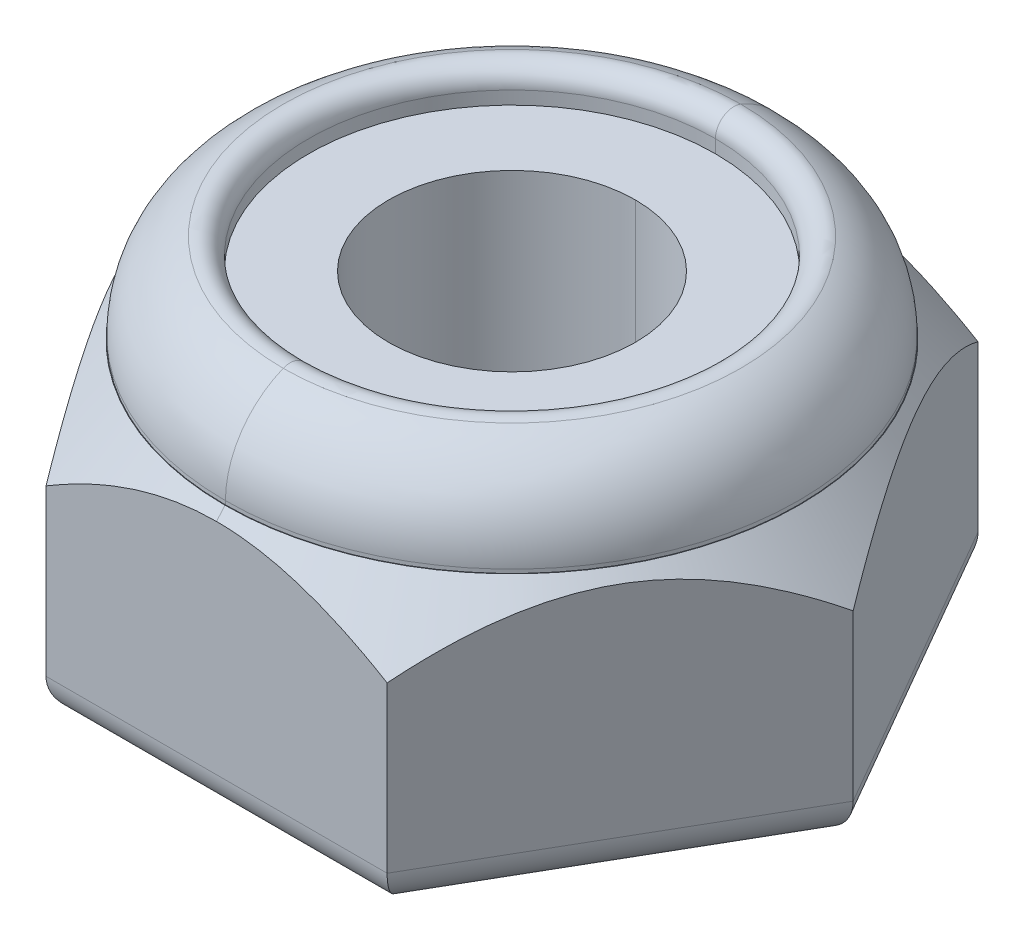
ISO-10303-21;
HEADER;
FILE_DESCRIPTION(('STEP AP214'),'2;1');
FILE_NAME('part.step','',(''),(''),'','','');
FILE_SCHEMA(('AUTOMOTIVE_DESIGN { 1 0 10303 214 1 1 1 1 }'));
ENDSEC;
DATA;
#1=APPLICATION_CONTEXT('core data for automotive mechanical design processes');
#2=APPLICATION_PROTOCOL_DEFINITION('international standard','automotive_design',2000,#1);
#3=PRODUCT_CONTEXT('',#1,'mechanical');
#4=PRODUCT('Part','Part','',(#3));
#5=PRODUCT_RELATED_PRODUCT_CATEGORY('part','',(#4));
#6=PRODUCT_DEFINITION_FORMATION('','',#4);
#7=PRODUCT_DEFINITION_CONTEXT('part definition',#1,'design');
#8=PRODUCT_DEFINITION('design','',#6,#7);
#9=PRODUCT_DEFINITION_SHAPE('','',#8);
#10=(LENGTH_UNIT() NAMED_UNIT(*) SI_UNIT(.MILLI.,.METRE.));
#11=(NAMED_UNIT(*) PLANE_ANGLE_UNIT() SI_UNIT($,.RADIAN.));
#12=(NAMED_UNIT(*) SI_UNIT($,.STERADIAN.) SOLID_ANGLE_UNIT());
#13=UNCERTAINTY_MEASURE_WITH_UNIT(LENGTH_MEASURE(1.E-05),#10,'distance_accuracy_value','');
#14=(GEOMETRIC_REPRESENTATION_CONTEXT(3) GLOBAL_UNCERTAINTY_ASSIGNED_CONTEXT((#13)) GLOBAL_UNIT_ASSIGNED_CONTEXT((#10,
#11,#12)) REPRESENTATION_CONTEXT('',''));
#15=CARTESIAN_POINT('',(0.,0.,0.));
#16=DIRECTION('',(0.,0.,1.));
#17=DIRECTION('',(1.,0.,0.));
#18=AXIS2_PLACEMENT_3D('',#15,#16,#17);
#19=CARTESIAN_POINT('',(0.,4.65025720786115,0.));
#20=DIRECTION('',(0.,-1.,0.));
#21=DIRECTION('',(0.,0.,-1.));
#22=AXIS2_PLACEMENT_3D('',#19,#20,#21);
#23=TOROIDAL_SURFACE('',#22,3.048,0.254);
#24=CARTESIAN_POINT('',(0.,4.65025720786115,0.));
#25=DIRECTION('',(0.,1.,0.));
#26=DIRECTION('',(0.,0.,-1.));
#27=AXIS2_PLACEMENT_3D('',#24,#25,#26);
#28=CIRCLE('',#27,2.794);
#29=CARTESIAN_POINT('',(0.,4.65025720786115,2.794));
#30=VERTEX_POINT('',#29);
#31=CARTESIAN_POINT('',(0.,4.65025720786115,-2.794));
#32=VERTEX_POINT('',#31);
#33=EDGE_CURVE('E394',#30,#32,#28,.T.);
#34=ORIENTED_EDGE('',*,*,#33,.F.);
#35=CARTESIAN_POINT('',(0.,4.65025720786115,3.048));
#36=DIRECTION('',(1.,0.,0.));
#37=DIRECTION('',(0.,0.,-1.));
#38=AXIS2_PLACEMENT_3D('',#35,#36,#37);
#39=CIRCLE('',#38,0.254);
#40=CARTESIAN_POINT('',(0.,4.88572150982643,3.14325));
#41=VERTEX_POINT('',#40);
#42=EDGE_CURVE('E30',#30,#41,#39,.T.);
#43=ORIENTED_EDGE('',*,*,#42,.T.);
#44=CARTESIAN_POINT('',(0.,4.88572150982643,0.));
#45=DIRECTION('',(0.,-1.,0.));
#46=DIRECTION('',(0.,0.,-1.));
#47=AXIS2_PLACEMENT_3D('',#44,#45,#46);
#48=CIRCLE('',#47,3.14325);
#49=CARTESIAN_POINT('',(0.,4.88572150982643,-3.14325));
#50=VERTEX_POINT('',#49);
#51=EDGE_CURVE('E295',#50,#41,#48,.T.);
#52=ORIENTED_EDGE('',*,*,#51,.F.);
#53=CARTESIAN_POINT('',(0.,4.65025720786115,-3.048));
#54=DIRECTION('',(-1.,0.,0.));
#55=DIRECTION('',(0.,0.,1.));
#56=AXIS2_PLACEMENT_3D('',#53,#54,#55);
#57=CIRCLE('',#56,0.254);
#58=EDGE_CURVE('E11',#32,#50,#57,.T.);
#59=ORIENTED_EDGE('',*,*,#58,.F.);
#60=EDGE_LOOP('',(#34,#43,#52,#59));
#61=FACE_BOUND('',#60,.T.);
#62=ADVANCED_FACE('F16',(#61),#23,.T.);
#63=CARTESIAN_POINT('',(0.,4.65025720786115,0.));
#64=DIRECTION('',(0.,-1.,0.));
#65=DIRECTION('',(0.,0.,-1.));
#66=AXIS2_PLACEMENT_3D('',#63,#64,#65);
#67=TOROIDAL_SURFACE('',#66,3.048,0.254);
#68=ORIENTED_EDGE('',*,*,#42,.F.);
#69=CARTESIAN_POINT('',(0.,4.65025720786115,0.));
#70=DIRECTION('',(0.,1.,0.));
#71=DIRECTION('',(0.,0.,-1.));
#72=AXIS2_PLACEMENT_3D('',#69,#70,#71);
#73=CIRCLE('',#72,2.794);
#74=EDGE_CURVE('E380',#32,#30,#73,.T.);
#75=ORIENTED_EDGE('',*,*,#74,.F.);
#76=ORIENTED_EDGE('',*,*,#58,.T.);
#77=CARTESIAN_POINT('',(0.,4.88572150982643,0.));
#78=DIRECTION('',(0.,-1.,0.));
#79=DIRECTION('',(0.,0.,-1.));
#80=AXIS2_PLACEMENT_3D('',#77,#78,#79);
#81=CIRCLE('',#80,3.14325);
#82=EDGE_CURVE('E294',#41,#50,#81,.T.);
#83=ORIENTED_EDGE('',*,*,#82,.F.);
#84=EDGE_LOOP('',(#68,#75,#76,#83));
#85=FACE_BOUND('',#84,.T.);
#86=ADVANCED_FACE('F464',(#85),#67,.T.);
#87=CARTESIAN_POINT('',(0.,3.7084,0.));
#88=DIRECTION('',(0.,1.,0.));
#89=DIRECTION('',(0.,0.,1.));
#90=AXIS2_PLACEMENT_3D('',#87,#88,#89);
#91=TOROIDAL_SURFACE('',#90,2.667,1.27);
#92=CARTESIAN_POINT('',(0.,3.7084,0.));
#93=DIRECTION('',(0.,-1.,0.));
#94=DIRECTION('',(0.,0.,1.));
#95=AXIS2_PLACEMENT_3D('',#92,#93,#94);
#96=CIRCLE('',#95,3.937);
#97=CARTESIAN_POINT('',(0.,3.7084,-3.937));
#98=VERTEX_POINT('',#97);
#99=CARTESIAN_POINT('',(0.,3.7084,3.937));
#100=VERTEX_POINT('',#99);
#101=EDGE_CURVE('E384',#98,#100,#96,.T.);
#102=ORIENTED_EDGE('',*,*,#101,.F.);
#103=CARTESIAN_POINT('',(0.,3.7084,-2.667));
#104=DIRECTION('',(1.,0.,0.));
#105=DIRECTION('',(0.,0.,-1.));
#106=AXIS2_PLACEMENT_3D('',#103,#104,#105);
#107=CIRCLE('',#106,1.27);
#108=EDGE_CURVE('E399',#98,#50,#107,.T.);
#109=ORIENTED_EDGE('',*,*,#108,.T.);
#110=ORIENTED_EDGE('',*,*,#51,.T.);
#111=CARTESIAN_POINT('',(0.,3.7084,2.667));
#112=DIRECTION('',(-1.,0.,0.));
#113=DIRECTION('',(0.,0.,1.));
#114=AXIS2_PLACEMENT_3D('',#111,#112,#113);
#115=CIRCLE('',#114,1.27);
#116=EDGE_CURVE('E306',#100,#41,#115,.T.);
#117=ORIENTED_EDGE('',*,*,#116,.F.);
#118=EDGE_LOOP('',(#102,#109,#110,#117));
#119=FACE_BOUND('',#118,.T.);
#120=ADVANCED_FACE('F758',(#119),#91,.T.);
#121=CARTESIAN_POINT('',(0.,3.7084,0.));
#122=DIRECTION('',(0.,1.,0.));
#123=DIRECTION('',(0.,0.,1.));
#124=AXIS2_PLACEMENT_3D('',#121,#122,#123);
#125=TOROIDAL_SURFACE('',#124,2.667,1.27);
#126=ORIENTED_EDGE('',*,*,#108,.F.);
#127=CARTESIAN_POINT('',(0.,3.7084,0.));
#128=DIRECTION('',(0.,-1.,0.));
#129=DIRECTION('',(0.,0.,1.));
#130=AXIS2_PLACEMENT_3D('',#127,#128,#129);
#131=CIRCLE('',#130,3.937);
#132=EDGE_CURVE('E371',#100,#98,#131,.T.);
#133=ORIENTED_EDGE('',*,*,#132,.F.);
#134=ORIENTED_EDGE('',*,*,#116,.T.);
#135=ORIENTED_EDGE('',*,*,#82,.T.);
#136=EDGE_LOOP('',(#126,#133,#134,#135));
#137=FACE_BOUND('',#136,.T.);
#138=ADVANCED_FACE('F907',(#137),#125,.T.);
#139=CARTESIAN_POINT('',(0.,4.4704,0.));
#140=DIRECTION('',(0.,1.,0.));
#141=DIRECTION('',(0.,0.,1.));
#142=AXIS2_PLACEMENT_3D('',#139,#140,#141);
#143=CYLINDRICAL_SURFACE('',#142,2.794);
#144=DIRECTION('',(0.,1.,0.));
#145=VECTOR('',#144,1.);
#146=CARTESIAN_POINT('',(0.,4.4704,-2.794));
#147=LINE('',#146,#145);
#148=CARTESIAN_POINT('',(0.,4.4704,-2.794));
#149=VERTEX_POINT('',#148);
#150=EDGE_CURVE('E385',#149,#32,#147,.T.);
#151=ORIENTED_EDGE('',*,*,#150,.F.);
#152=CARTESIAN_POINT('',(0.,4.4704,0.));
#153=DIRECTION('',(0.,1.,0.));
#154=DIRECTION('',(0.,0.,1.));
#155=AXIS2_PLACEMENT_3D('',#152,#153,#154);
#156=CIRCLE('',#155,2.794);
#157=CARTESIAN_POINT('',(0.,4.4704,2.794));
#158=VERTEX_POINT('',#157);
#159=EDGE_CURVE('E355',#158,#149,#156,.T.);
#160=ORIENTED_EDGE('',*,*,#159,.F.);
#161=DIRECTION('',(0.,1.,0.));
#162=VECTOR('',#161,1.);
#163=CARTESIAN_POINT('',(0.,4.4704,2.794));
#164=LINE('',#163,#162);
#165=EDGE_CURVE('E381',#158,#30,#164,.T.);
#166=ORIENTED_EDGE('',*,*,#165,.T.);
#167=ORIENTED_EDGE('',*,*,#33,.T.);
#168=EDGE_LOOP('',(#151,#160,#166,#167));
#169=FACE_BOUND('',#168,.T.);
#170=ADVANCED_FACE('F900',(#169),#143,.F.);
#171=CARTESIAN_POINT('',(0.,4.4704,0.));
#172=DIRECTION('',(0.,1.,0.));
#173=DIRECTION('',(0.,0.,1.));
#174=AXIS2_PLACEMENT_3D('',#171,#172,#173);
#175=CYLINDRICAL_SURFACE('',#174,2.794);
#176=CARTESIAN_POINT('',(0.,4.4704,0.));
#177=DIRECTION('',(0.,1.,0.));
#178=DIRECTION('',(0.,0.,1.));
#179=AXIS2_PLACEMENT_3D('',#176,#177,#178);
#180=CIRCLE('',#179,2.794);
#181=EDGE_CURVE('E357',#149,#158,#180,.T.);
#182=ORIENTED_EDGE('',*,*,#181,.F.);
#183=ORIENTED_EDGE('',*,*,#150,.T.);
#184=ORIENTED_EDGE('',*,*,#74,.T.);
#185=ORIENTED_EDGE('',*,*,#165,.F.);
#186=EDGE_LOOP('',(#182,#183,#184,#185));
#187=FACE_BOUND('',#186,.T.);
#188=ADVANCED_FACE('F886',(#187),#175,.F.);
#189=CARTESIAN_POINT('',(0.,4.9784,0.));
#190=DIRECTION('',(0.,-1.,0.));
#191=DIRECTION('',(0.,0.,-1.));
#192=AXIS2_PLACEMENT_3D('',#189,#190,#191);
#193=CYLINDRICAL_SURFACE('',#192,3.937);
#194=ORIENTED_EDGE('',*,*,#101,.T.);
#195=DIRECTION('',(0.,-1.,0.));
#196=VECTOR('',#195,1.);
#197=CARTESIAN_POINT('',(0.,4.9784,3.937));
#198=LINE('',#197,#196);
#199=CARTESIAN_POINT('',(0.,3.6576,3.937));
#200=VERTEX_POINT('',#199);
#201=EDGE_CURVE('E370',#100,#200,#198,.T.);
#202=ORIENTED_EDGE('',*,*,#201,.T.);
#203=CARTESIAN_POINT('',(0.,3.6576,0.));
#204=DIRECTION('',(0.,1.,0.));
#205=DIRECTION('',(0.,0.,-1.));
#206=AXIS2_PLACEMENT_3D('',#203,#204,#205);
#207=CIRCLE('',#206,3.937);
#208=CARTESIAN_POINT('',(0.,3.6576,-3.937));
#209=VERTEX_POINT('',#208);
#210=EDGE_CURVE('E360',#200,#209,#207,.T.);
#211=ORIENTED_EDGE('',*,*,#210,.T.);
#212=DIRECTION('',(0.,-1.,0.));
#213=VECTOR('',#212,1.);
#214=CARTESIAN_POINT('',(0.,4.9784,-3.937));
#215=LINE('',#214,#213);
#216=EDGE_CURVE('E377',#98,#209,#215,.T.);
#217=ORIENTED_EDGE('',*,*,#216,.F.);
#218=EDGE_LOOP('',(#194,#202,#211,#217));
#219=FACE_BOUND('',#218,.T.);
#220=ADVANCED_FACE('F874',(#219),#193,.T.);
#221=CARTESIAN_POINT('',(0.,4.9784,0.));
#222=DIRECTION('',(0.,-1.,0.));
#223=DIRECTION('',(0.,0.,-1.));
#224=AXIS2_PLACEMENT_3D('',#221,#222,#223);
#225=CYLINDRICAL_SURFACE('',#224,3.937);
#226=ORIENTED_EDGE('',*,*,#201,.F.);
#227=ORIENTED_EDGE('',*,*,#132,.T.);
#228=ORIENTED_EDGE('',*,*,#216,.T.);
#229=CARTESIAN_POINT('',(0.,3.6576,0.));
#230=DIRECTION('',(0.,1.,0.));
#231=DIRECTION('',(0.,0.,-1.));
#232=AXIS2_PLACEMENT_3D('',#229,#230,#231);
#233=CIRCLE('',#232,3.937);
#234=EDGE_CURVE('E359',#209,#200,#233,.T.);
#235=ORIENTED_EDGE('',*,*,#234,.T.);
#236=EDGE_LOOP('',(#226,#227,#228,#235));
#237=FACE_BOUND('',#236,.T.);
#238=ADVANCED_FACE('F863',(#237),#225,.T.);
#239=CARTESIAN_POINT('',(2.34315,3.6576,4.05845484975502));
#240=DIRECTION('',(-0.866025403784439,0.,-0.5));
#241=DIRECTION('',(-0.5,0.,0.866025403784439));
#242=AXIS2_PLACEMENT_3D('',#239,#240,#241);
#243=PLANE('',#242);
#244=DIRECTION('',(0.,-1.,0.));
#245=VECTOR('',#244,1.);
#246=CARTESIAN_POINT('',(2.34315,3.6576,4.05845484975502));
#247=LINE('',#246,#245);
#248=CARTESIAN_POINT('',(2.34315,2.77304593389833,4.05845484975502));
#249=VERTEX_POINT('',#248);
#250=CARTESIAN_POINT('',(2.34315,0.508,4.05845484975502));
#251=VERTEX_POINT('',#250);
#252=EDGE_CURVE('E296',#249,#251,#247,.T.);
#253=ORIENTED_EDGE('',*,*,#252,.T.);
#254=DIRECTION('',(0.5,0.,-0.866025403784439));
#255=VECTOR('',#254,1.);
#256=CARTESIAN_POINT('',(4.6863,0.508,0.));
#257=LINE('',#256,#255);
#258=CARTESIAN_POINT('',(4.6863,0.508,0.));
#259=VERTEX_POINT('',#258);
#260=EDGE_CURVE('E298',#251,#259,#257,.T.);
#261=ORIENTED_EDGE('',*,*,#260,.T.);
#262=DIRECTION('',(0.,-1.,0.));
#263=VECTOR('',#262,1.);
#264=CARTESIAN_POINT('',(4.6863,3.6576,0.));
#265=LINE('',#264,#263);
#266=CARTESIAN_POINT('',(4.6863,2.77304593389833,0.));
#267=VERTEX_POINT('',#266);
#268=EDGE_CURVE('E362',#267,#259,#265,.T.);
#269=ORIENTED_EDGE('',*,*,#268,.F.);
#270=CARTESIAN_POINT('',(4.6863,2.77304593389833,0.));
#271=CARTESIAN_POINT('',(4.39362593043005,3.12184130776748,0.5069263585531));
#272=CARTESIAN_POINT('',(4.12856143682879,3.30483611799242,0.966031528752994));
#273=CARTESIAN_POINT('',(3.81672179864764,3.52012347932199,1.50615362589664));
#274=CARTESIAN_POINT('',(3.51773352060174,3.52127733158309,2.02401651433968));
#275=CARTESIAN_POINT('',(3.21843636566004,3.52243237585849,2.54241439325952));
#276=CARTESIAN_POINT('',(2.9054006394738,3.30793950753324,3.0846081755983));
#277=CARTESIAN_POINT('',(2.63855559043972,3.12509660757727,3.54679735827354));
#278=CARTESIAN_POINT('',(2.34315,2.77304593389832,4.05845484975501));
#279=B_SPLINE_CURVE_WITH_KNOTS('',2,(#270,#271,#272,#273,#274,#275,#276,#277,#278),
.UNSPECIFIED.,.F.,.F.,(3,2,2,2,3),(0.,0.25,0.5,0.75,1.),.UNSPECIFIED.);
#280=EDGE_CURVE('E349',#267,#249,#279,.T.);
#281=ORIENTED_EDGE('',*,*,#280,.T.);
#282=EDGE_LOOP('',(#253,#261,#269,#281));
#283=FACE_BOUND('',#282,.T.);
#284=ADVANCED_FACE('F853',(#283),#243,.F.);
#285=CARTESIAN_POINT('',(0.,4.4704,0.));
#286=DIRECTION('',(0.,1.,0.));
#287=DIRECTION('',(1.,0.,0.));
#288=AXIS2_PLACEMENT_3D('',#285,#286,#287);
#289=PLANE('',#288);
#290=CARTESIAN_POINT('',(0.,4.4704,0.));
#291=DIRECTION('',(0.,-1.,0.));
#292=DIRECTION('',(0.,0.,1.));
#293=AXIS2_PLACEMENT_3D('',#290,#291,#292);
#294=CIRCLE('',#293,1.69545);
#295=CARTESIAN_POINT('',(0.,4.4704,1.69545));
#296=VERTEX_POINT('',#295);
#297=CARTESIAN_POINT('',(0.,4.4704,-1.69545));
#298=VERTEX_POINT('',#297);
#299=EDGE_CURVE('E297',#296,#298,#294,.T.);
#300=ORIENTED_EDGE('',*,*,#299,.T.);
#301=CARTESIAN_POINT('',(0.,4.4704,0.));
#302=DIRECTION('',(0.,-1.,0.));
#303=DIRECTION('',(0.,0.,1.));
#304=AXIS2_PLACEMENT_3D('',#301,#302,#303);
#305=CIRCLE('',#304,1.69545);
#306=EDGE_CURVE('E337',#298,#296,#305,.T.);
#307=ORIENTED_EDGE('',*,*,#306,.T.);
#308=EDGE_LOOP('',(#300,#307));
#309=FACE_BOUND('',#308,.T.);
#310=ORIENTED_EDGE('',*,*,#159,.T.);
#311=ORIENTED_EDGE('',*,*,#181,.T.);
#312=EDGE_LOOP('',(#310,#311));
#313=FACE_BOUND('',#312,.T.);
#314=ADVANCED_FACE('F822',(#309,#313),#289,.T.);
#315=CARTESIAN_POINT('',(2.34315,3.6576,4.05845484975502));
#316=DIRECTION('',(0.,-1.,0.));
#317=DIRECTION('',(0.,0.,-1.));
#318=AXIS2_PLACEMENT_3D('',#315,#316,#317);
#319=PLANE('',#318);
#320=ORIENTED_EDGE('',*,*,#234,.F.);
#321=ORIENTED_EDGE('',*,*,#210,.F.);
#322=EDGE_LOOP('',(#320,#321));
#323=FACE_BOUND('',#322,.T.);
#324=CARTESIAN_POINT('',(0.,3.6576,0.));
#325=DIRECTION('',(0.,1.,0.));
#326=DIRECTION('',(0.,0.,1.));
#327=AXIS2_PLACEMENT_3D('',#324,#325,#326);
#328=CIRCLE('',#327,3.94407100937772);
#329=CARTESIAN_POINT('',(0.,3.6576,-3.94407100937772));
#330=VERTEX_POINT('',#329);
#331=CARTESIAN_POINT('',(0.,3.6576,3.94407100937772));
#332=VERTEX_POINT('',#331);
#333=EDGE_CURVE('E301',#330,#332,#328,.T.);
#334=ORIENTED_EDGE('',*,*,#333,.T.);
#335=CARTESIAN_POINT('',(0.,3.6576,0.));
#336=DIRECTION('',(0.,1.,0.));
#337=DIRECTION('',(0.,0.,1.));
#338=AXIS2_PLACEMENT_3D('',#335,#336,#337);
#339=CIRCLE('',#338,3.94407100937772);
#340=EDGE_CURVE('E350',#332,#330,#339,.T.);
#341=ORIENTED_EDGE('',*,*,#340,.T.);
#342=EDGE_LOOP('',(#334,#341));
#343=FACE_BOUND('',#342,.T.);
#344=ADVANCED_FACE('F426',(#323,#343),#319,.F.);
#345=CARTESIAN_POINT('',(4.6863,3.6576,0.));
#346=DIRECTION('',(-0.866025403784439,0.,0.5));
#347=DIRECTION('',(0.,1.,0.));
#348=AXIS2_PLACEMENT_3D('',#345,#346,#347);
#349=PLANE('',#348);
#350=ORIENTED_EDGE('',*,*,#268,.T.);
#351=DIRECTION('',(-0.5,0.,-0.866025403784439));
#352=VECTOR('',#351,1.);
#353=CARTESIAN_POINT('',(2.34315,0.508,-4.05845484975502));
#354=LINE('',#353,#352);
#355=CARTESIAN_POINT('',(2.34315,0.508,-4.05845484975502));
#356=VERTEX_POINT('',#355);
#357=EDGE_CURVE('E246',#259,#356,#354,.T.);
#358=ORIENTED_EDGE('',*,*,#357,.T.);
#359=DIRECTION('',(0.,-1.,0.));
#360=VECTOR('',#359,1.);
#361=CARTESIAN_POINT('',(2.34315,3.6576,-4.05845484975502));
#362=LINE('',#361,#360);
#363=CARTESIAN_POINT('',(2.34315,2.77304593389832,-4.05845484975502));
#364=VERTEX_POINT('',#363);
#365=EDGE_CURVE('E540',#364,#356,#362,.T.);
#366=ORIENTED_EDGE('',*,*,#365,.F.);
#367=CARTESIAN_POINT('',(2.34315,2.77304593389832,-4.05845484975502));
#368=CARTESIAN_POINT('',(2.63582406957024,3.12184130776783,-3.55152849120141));
#369=CARTESIAN_POINT('',(2.90088856317121,3.30483611799242,-3.09242332100202));
#370=CARTESIAN_POINT('',(3.21272820135192,3.52012347932151,-2.55230122385913));
#371=CARTESIAN_POINT('',(3.51171647939826,3.52127733158309,-2.03443833541533));
#372=CARTESIAN_POINT('',(3.81101363433985,3.52243237585897,-1.51604045649569));
#373=CARTESIAN_POINT('',(4.1240493605262,3.30793950753324,-0.973846674156717));
#374=CARTESIAN_POINT('',(4.39089440956094,3.12509660757648,-0.511657491480331));
#375=CARTESIAN_POINT('',(4.6863,2.77304593389833,0.));
#376=B_SPLINE_CURVE_WITH_KNOTS('',2,(#367,#368,#369,#370,#371,#372,#373,#374,#375),
.UNSPECIFIED.,.F.,.F.,(3,2,2,2,3),(0.,0.25,0.5,0.75,1.),.UNSPECIFIED.);
#377=EDGE_CURVE('E415',#364,#267,#376,.T.);
#378=ORIENTED_EDGE('',*,*,#377,.T.);
#379=EDGE_LOOP('',(#350,#358,#366,#378));
#380=FACE_BOUND('',#379,.T.);
#381=ADVANCED_FACE('F416',(#380),#349,.F.);
#382=CARTESIAN_POINT('',(0.,0.956813458784764,0.));
#383=DIRECTION('',(0.,-1.,0.));
#384=DIRECTION('',(0.,0.,-1.));
#385=AXIS2_PLACEMENT_3D('',#382,#383,#384);
#386=CONICAL_SURFACE('',#385,6.2103,0.698131700797737);
#387=ORIENTED_EDGE('',*,*,#340,.F.);
#388=DIRECTION('',(0.,-0.766044443118975,0.642787609686544));
#389=VECTOR('',#388,1.);
#390=CARTESIAN_POINT('',(0.,0.956813458784764,6.2103));
#391=LINE('',#390,#389);
#392=CARTESIAN_POINT('',(0.,3.52128264729563,4.05845484975502));
#393=VERTEX_POINT('',#392);
#394=EDGE_CURVE('E308',#332,#393,#391,.T.);
#395=ORIENTED_EDGE('',*,*,#394,.T.);
#396=CARTESIAN_POINT('',(2.34315,2.77304593389832,4.05845484975502));
#397=CARTESIAN_POINT('',(1.75468614902204,3.12369788815598,4.05845484975502));
#398=CARTESIAN_POINT('',(1.22193629402458,3.30681134786508,4.05845484975502));
#399=CARTESIAN_POINT('',(0.597954016292195,3.52128264729563,4.05845484975502));
#400=CARTESIAN_POINT('',(0.,3.52128264729563,4.05845484975502));
#401=B_SPLINE_CURVE_WITH_KNOTS('',2,(#396,#397,#398,#399,#400),.UNSPECIFIED.,.F.,.F.,(3,2,3),
(0.,0.5,1.),.UNSPECIFIED.);
#402=EDGE_CURVE('E351',#249,#393,#401,.T.);
#403=ORIENTED_EDGE('',*,*,#402,.F.);
#404=ORIENTED_EDGE('',*,*,#280,.F.);
#405=ORIENTED_EDGE('',*,*,#377,.F.);
#406=CARTESIAN_POINT('',(0.,3.52128264729562,-4.05845484975502));
#407=CARTESIAN_POINT('',(0.597472491144505,3.52128264729562,-4.05845484975502));
#408=CARTESIAN_POINT('',(1.22193629402458,3.30681134786508,-4.05845484975502));
#409=CARTESIAN_POINT('',(1.75412678525716,3.12403120004416,-4.05845484975502));
#410=CARTESIAN_POINT('',(2.34315000000001,2.77304593389832,-4.05845484975502));
#411=B_SPLINE_CURVE_WITH_KNOTS('',2,(#406,#407,#408,#409,#410),.UNSPECIFIED.,.F.,.F.,(3,2,3),
(0.,0.5,1.),.UNSPECIFIED.);
#412=CARTESIAN_POINT('',(0.,3.52128264729563,-4.05845484975502));
#413=VERTEX_POINT('',#412);
#414=EDGE_CURVE('E550',#413,#364,#411,.T.);
#415=ORIENTED_EDGE('',*,*,#414,.F.);
#416=DIRECTION('',(0.,-0.766044443118975,-0.642787609686544));
#417=VECTOR('',#416,1.);
#418=CARTESIAN_POINT('',(0.,0.956813458784764,-6.2103));
#419=LINE('',#418,#417);
#420=EDGE_CURVE('E305',#330,#413,#419,.T.);
#421=ORIENTED_EDGE('',*,*,#420,.F.);
#422=EDGE_LOOP('',(#387,#395,#403,#404,#405,#415,#421));
#423=FACE_BOUND('',#422,.T.);
#424=ADVANCED_FACE('F430',(#423),#386,.T.);
#425=CARTESIAN_POINT('',(-2.34315,3.6576,4.05845484975502));
#426=DIRECTION('',(0.,0.,-1.));
#427=DIRECTION('',(0.,-1.,0.));
#428=AXIS2_PLACEMENT_3D('',#425,#426,#427);
#429=PLANE('',#428);
#430=DIRECTION('',(0.,-1.,0.));
#431=VECTOR('',#430,1.);
#432=CARTESIAN_POINT('',(-2.34315,3.6576,4.05845484975502));
#433=LINE('',#432,#431);
#434=CARTESIAN_POINT('',(-2.34315,2.77304593389833,4.05845484975502));
#435=VERTEX_POINT('',#434);
#436=CARTESIAN_POINT('',(-2.34315,0.508,4.05845484975502));
#437=VERTEX_POINT('',#436);
#438=EDGE_CURVE('E291',#435,#437,#433,.T.);
#439=ORIENTED_EDGE('',*,*,#438,.T.);
#440=DIRECTION('',(1.,0.,0.));
#441=VECTOR('',#440,1.);
#442=CARTESIAN_POINT('',(2.34315,0.508,4.05845484975502));
#443=LINE('',#442,#441);
#444=EDGE_CURVE('E253',#437,#251,#443,.T.);
#445=ORIENTED_EDGE('',*,*,#444,.T.);
#446=ORIENTED_EDGE('',*,*,#252,.F.);
#447=ORIENTED_EDGE('',*,*,#402,.T.);
#448=CARTESIAN_POINT('',(0.,3.52128264729563,4.05845484975502));
#449=CARTESIAN_POINT('',(-0.597186315291645,3.52128264729563,4.05845484975502));
#450=CARTESIAN_POINT('',(-1.22131518352051,3.30702470095747,4.05845484975502));
#451=CARTESIAN_POINT('',(-1.75379435019951,3.12422929038104,4.05845484975502));
#452=CARTESIAN_POINT('',(-2.34315,2.77304593389833,4.05845484975502));
#453=B_SPLINE_CURVE_WITH_KNOTS('',2,(#448,#449,#450,#451,#452),.UNSPECIFIED.,.F.,.F.,(3,2,3),
(0.,0.5,1.),.UNSPECIFIED.);
#454=EDGE_CURVE('E320',#393,#435,#453,.T.);
#455=ORIENTED_EDGE('',*,*,#454,.T.);
#456=EDGE_LOOP('',(#439,#445,#446,#447,#455));
#457=FACE_BOUND('',#456,.T.);
#458=ADVANCED_FACE('F815',(#457),#429,.F.);
#459=CARTESIAN_POINT('',(0.,0.,0.));
#460=DIRECTION('',(0.,1.,0.));
#461=DIRECTION('',(0.,0.,1.));
#462=AXIS2_PLACEMENT_3D('',#459,#460,#461);
#463=CYLINDRICAL_SURFACE('',#462,1.69545);
#464=CARTESIAN_POINT('',(0.,0.,0.));
#465=DIRECTION('',(0.,1.,0.));
#466=DIRECTION('',(0.,0.,1.));
#467=AXIS2_PLACEMENT_3D('',#464,#465,#466);
#468=CIRCLE('',#467,1.69545);
#469=CARTESIAN_POINT('',(0.,0.,-1.69545));
#470=VERTEX_POINT('',#469);
#471=CARTESIAN_POINT('',(0.,0.,1.69545));
#472=VERTEX_POINT('',#471);
#473=EDGE_CURVE('E274',#470,#472,#468,.T.);
#474=ORIENTED_EDGE('',*,*,#473,.F.);
#475=DIRECTION('',(0.,1.,0.));
#476=VECTOR('',#475,1.);
#477=CARTESIAN_POINT('',(0.,0.,-1.69545));
#478=LINE('',#477,#476);
#479=EDGE_CURVE('E326',#470,#298,#478,.T.);
#480=ORIENTED_EDGE('',*,*,#479,.T.);
#481=ORIENTED_EDGE('',*,*,#299,.F.);
#482=DIRECTION('',(0.,1.,0.));
#483=VECTOR('',#482,1.);
#484=CARTESIAN_POINT('',(0.,0.,1.69545));
#485=LINE('',#484,#483);
#486=EDGE_CURVE('E338',#472,#296,#485,.T.);
#487=ORIENTED_EDGE('',*,*,#486,.F.);
#488=EDGE_LOOP('',(#474,#480,#481,#487));
#489=FACE_BOUND('',#488,.T.);
#490=ADVANCED_FACE('F803',(#489),#463,.F.);
#491=CARTESIAN_POINT('',(1.90320909487751,0.508,3.80445484975502));
#492=DIRECTION('',(-0.5,0.,0.866025403784439));
#493=DIRECTION('',(0.866025403784439,0.,0.5));
#494=AXIS2_PLACEMENT_3D('',#491,#492,#493);
#495=CYLINDRICAL_SURFACE('',#494,0.508);
#496=CARTESIAN_POINT('',(4.09971212650334,0.,0.));
#497=CARTESIAN_POINT('',(4.44332734727409,0.,0.));
#498=CARTESIAN_POINT('',(4.6863,0.210420489685532,0.));
#499=CARTESIAN_POINT('',(4.6863,0.508,0.));
#500=(BOUNDED_CURVE() B_SPLINE_CURVE(3,(#496,#497,#498,#499),.UNSPECIFIED.,.F.,
.F.) B_SPLINE_CURVE_WITH_KNOTS((4,4),(1.5707963267949,3.1415926535898),
.UNSPECIFIED.) CURVE() GEOMETRIC_REPRESENTATION_ITEM() RATIONAL_B_SPLINE_CURVE((1.,
0.804737854124365,0.804737854124365,1.)) REPRESENTATION_ITEM(''));
#501=CARTESIAN_POINT('',(4.09971212650334,0.,0.));
#502=VERTEX_POINT('',#501);
#503=EDGE_CURVE('E251',#502,#259,#500,.T.);
#504=ORIENTED_EDGE('',*,*,#503,.T.);
#505=ORIENTED_EDGE('',*,*,#260,.F.);
#506=CARTESIAN_POINT('',(2.04985606325167,0.,3.55045484975502));
#507=CARTESIAN_POINT('',(2.22166367363705,0.,3.84803436006948));
#508=CARTESIAN_POINT('',(2.34315,0.210420489685532,4.05845484975502));
#509=CARTESIAN_POINT('',(2.34315,0.508,4.05845484975502));
#510=(BOUNDED_CURVE() B_SPLINE_CURVE(3,(#506,#507,#508,#509),.UNSPECIFIED.,.F.,
.F.) B_SPLINE_CURVE_WITH_KNOTS((4,4),(4.71238898038469,6.28318530717959),
.UNSPECIFIED.) CURVE() GEOMETRIC_REPRESENTATION_ITEM() RATIONAL_B_SPLINE_CURVE((1.,
0.804737854124365,0.804737854124365,1.)) REPRESENTATION_ITEM(''));
#511=CARTESIAN_POINT('',(2.04985606325167,0.,3.55045484975502));
#512=VERTEX_POINT('',#511);
#513=EDGE_CURVE('E315',#512,#251,#510,.T.);
#514=ORIENTED_EDGE('',*,*,#513,.F.);
#515=DIRECTION('',(-0.5,0.,0.866025403784439));
#516=VECTOR('',#515,1.);
#517=CARTESIAN_POINT('',(1.90320909487751,0.,3.80445484975502));
#518=LINE('',#517,#516);
#519=EDGE_CURVE('E201',#502,#512,#518,.T.);
#520=ORIENTED_EDGE('',*,*,#519,.F.);
#521=EDGE_LOOP('',(#504,#505,#514,#520));
#522=FACE_BOUND('',#521,.T.);
#523=ADVANCED_FACE('F440',(#522),#495,.T.);
#524=CARTESIAN_POINT('',(0.,0.,0.));
#525=DIRECTION('',(0.,1.,0.));
#526=DIRECTION('',(0.,0.,1.));
#527=AXIS2_PLACEMENT_3D('',#524,#525,#526);
#528=CYLINDRICAL_SURFACE('',#527,1.69545);
#529=ORIENTED_EDGE('',*,*,#479,.F.);
#530=CARTESIAN_POINT('',(0.,0.,0.));
#531=DIRECTION('',(0.,1.,0.));
#532=DIRECTION('',(0.,0.,1.));
#533=AXIS2_PLACEMENT_3D('',#530,#531,#532);
#534=CIRCLE('',#533,1.69545);
#535=EDGE_CURVE('E247',#472,#470,#534,.T.);
#536=ORIENTED_EDGE('',*,*,#535,.F.);
#537=ORIENTED_EDGE('',*,*,#486,.T.);
#538=ORIENTED_EDGE('',*,*,#306,.F.);
#539=EDGE_LOOP('',(#529,#536,#537,#538));
#540=FACE_BOUND('',#539,.T.);
#541=ADVANCED_FACE('F717',(#540),#528,.F.);
#542=CARTESIAN_POINT('',(4.2463590948775,0.508,0.253999999999997));
#543=DIRECTION('',(0.5,0.,0.866025403784439));
#544=DIRECTION('',(0.866025403784439,0.,-0.5));
#545=AXIS2_PLACEMENT_3D('',#542,#543,#544);
#546=CYLINDRICAL_SURFACE('',#545,0.508);
#547=CARTESIAN_POINT('',(2.04985606325167,0.,-3.55045484975502));
#548=CARTESIAN_POINT('',(2.22166367363705,0.,-3.84803436006948));
#549=CARTESIAN_POINT('',(2.34315,0.210420489685532,-4.05845484975502));
#550=CARTESIAN_POINT('',(2.34315,0.508,-4.05845484975502));
#551=(BOUNDED_CURVE() B_SPLINE_CURVE(3,(#547,#548,#549,#550),.UNSPECIFIED.,.F.,
.F.) B_SPLINE_CURVE_WITH_KNOTS((4,4),(1.5707963267949,3.1415926535898),
.UNSPECIFIED.) CURVE() GEOMETRIC_REPRESENTATION_ITEM() RATIONAL_B_SPLINE_CURVE((1.,
0.804737854124365,0.804737854124365,1.)) REPRESENTATION_ITEM(''));
#552=CARTESIAN_POINT('',(2.04985606325167,0.,-3.55045484975502));
#553=VERTEX_POINT('',#552);
#554=EDGE_CURVE('E279',#553,#356,#551,.T.);
#555=ORIENTED_EDGE('',*,*,#554,.T.);
#556=ORIENTED_EDGE('',*,*,#357,.F.);
#557=ORIENTED_EDGE('',*,*,#503,.F.);
#558=DIRECTION('',(0.5,0.,0.866025403784439));
#559=VECTOR('',#558,1.);
#560=CARTESIAN_POINT('',(4.2463590948775,0.,0.253999999999997));
#561=LINE('',#560,#559);
#562=EDGE_CURVE('E242',#553,#502,#561,.T.);
#563=ORIENTED_EDGE('',*,*,#562,.F.);
#564=EDGE_LOOP('',(#555,#556,#557,#563));
#565=FACE_BOUND('',#564,.T.);
#566=ADVANCED_FACE('F711',(#565),#546,.T.);
#567=CARTESIAN_POINT('',(-2.34315,0.508,3.55045484975502));
#568=DIRECTION('',(-1.,0.,0.));
#569=DIRECTION('',(0.,0.,1.));
#570=AXIS2_PLACEMENT_3D('',#567,#568,#569);
#571=CYLINDRICAL_SURFACE('',#570,0.508);
#572=CARTESIAN_POINT('',(-2.34315,0.508,4.05845484975502));
#573=CARTESIAN_POINT('',(-2.34315000000001,0.210420489685532,4.05845484975501));
#574=CARTESIAN_POINT('',(-2.22166367363705,0.,3.84803436006948));
#575=CARTESIAN_POINT('',(-2.04985606325167,0.,3.55045484975502));
#576=(BOUNDED_CURVE() B_SPLINE_CURVE(3,(#572,#573,#574,#575),.UNSPECIFIED.,.F.,
.F.) B_SPLINE_CURVE_WITH_KNOTS((4,4),(3.1415926535898,4.71238898038469),
.UNSPECIFIED.) CURVE() GEOMETRIC_REPRESENTATION_ITEM() RATIONAL_B_SPLINE_CURVE((1.,
0.804737854124365,0.804737854124365,1.)) REPRESENTATION_ITEM(''));
#577=CARTESIAN_POINT('',(-2.04985606325167,0.,3.55045484975502));
#578=VERTEX_POINT('',#577);
#579=EDGE_CURVE('E200',#437,#578,#576,.T.);
#580=ORIENTED_EDGE('',*,*,#579,.T.);
#581=DIRECTION('',(-1.,0.,0.));
#582=VECTOR('',#581,1.);
#583=CARTESIAN_POINT('',(-2.34315,0.,3.55045484975502));
#584=LINE('',#583,#582);
#585=EDGE_CURVE('E259',#512,#578,#584,.T.);
#586=ORIENTED_EDGE('',*,*,#585,.F.);
#587=ORIENTED_EDGE('',*,*,#513,.T.);
#588=ORIENTED_EDGE('',*,*,#444,.F.);
#589=EDGE_LOOP('',(#580,#586,#587,#588));
#590=FACE_BOUND('',#589,.T.);
#591=ADVANCED_FACE('F462',(#590),#571,.T.);
#592=CARTESIAN_POINT('',(0.,0.956813458784764,0.));
#593=DIRECTION('',(0.,-1.,0.));
#594=DIRECTION('',(0.,0.,-1.));
#595=AXIS2_PLACEMENT_3D('',#592,#593,#594);
#596=CONICAL_SURFACE('',#595,6.2103,0.698131700797737);
#597=ORIENTED_EDGE('',*,*,#394,.F.);
#598=ORIENTED_EDGE('',*,*,#333,.F.);
#599=ORIENTED_EDGE('',*,*,#420,.T.);
#600=CARTESIAN_POINT('',(-2.34315,2.77304593389832,-4.05845484975502));
#601=CARTESIAN_POINT('',(-1.75435004808064,3.12389816290792,-4.05845484975502));
#602=CARTESIAN_POINT('',(-1.22131518352051,3.30702470095747,-4.05845484975502));
#603=CARTESIAN_POINT('',(-0.59766469231539,3.52128264729562,-4.05845484975502));
#604=CARTESIAN_POINT('',(0.,3.52128264729562,-4.05845484975502));
#605=B_SPLINE_CURVE_WITH_KNOTS('',2,(#600,#601,#602,#603,#604),.UNSPECIFIED.,.F.,.F.,(3,2,3),
(0.,0.5,1.),.UNSPECIFIED.);
#606=CARTESIAN_POINT('',(-2.34315,2.77304593389832,-4.05845484975502));
#607=VERTEX_POINT('',#606);
#608=EDGE_CURVE('E544',#607,#413,#605,.T.);
#609=ORIENTED_EDGE('',*,*,#608,.F.);
#610=CARTESIAN_POINT('',(-4.6863,2.77304593389832,0.));
#611=CARTESIAN_POINT('',(-4.39362593043036,3.1218413077671,-0.506926358552564));
#612=CARTESIAN_POINT('',(-4.12856143682879,3.30483611799241,-0.966031528753003));
#613=CARTESIAN_POINT('',(-3.8167217986486,3.5201234793215,-1.50615362589498));
#614=CARTESIAN_POINT('',(-3.51773352060173,3.52127733158308,-2.02401651433969));
#615=CARTESIAN_POINT('',(-3.21843636566085,3.52243237585896,-2.54241439325811));
#616=CARTESIAN_POINT('',(-2.9054006394738,3.30793950753323,-3.08460817559831));
#617=CARTESIAN_POINT('',(-2.63855559043987,3.12509660757744,-3.54679735827329));
#618=CARTESIAN_POINT('',(-2.34315,2.77304593389832,-4.05845484975502));
#619=B_SPLINE_CURVE_WITH_KNOTS('',2,(#610,#611,#612,#613,#614,#615,#616,#617,#618),
.UNSPECIFIED.,.F.,.F.,(3,2,2,2,3),(0.,0.25,0.5,0.75,1.),.UNSPECIFIED.);
#620=CARTESIAN_POINT('',(-4.6863,2.77304593389832,0.));
#621=VERTEX_POINT('',#620);
#622=EDGE_CURVE('E215',#621,#607,#619,.T.);
#623=ORIENTED_EDGE('',*,*,#622,.F.);
#624=CARTESIAN_POINT('',(-2.34315,2.77304593389833,4.05845484975501));
#625=CARTESIAN_POINT('',(-2.63582406956844,3.12184130776568,3.55152849120453));
#626=CARTESIAN_POINT('',(-2.90088856317121,3.30483611799242,3.09242332100202));
#627=CARTESIAN_POINT('',(-3.21272820135037,3.5201234793215,2.55230122386181));
#628=CARTESIAN_POINT('',(-3.51171647939826,3.52127733158309,2.03443833541533));
#629=CARTESIAN_POINT('',(-3.81101363433991,3.52243237585897,1.51604045649558));
#630=CARTESIAN_POINT('',(-4.1240493605262,3.30793950753324,0.973846674156709));
#631=CARTESIAN_POINT('',(-4.39089440956102,3.12509660757638,0.51165749148019));
#632=CARTESIAN_POINT('',(-4.6863,2.77304593389832,0.));
#633=B_SPLINE_CURVE_WITH_KNOTS('',2,(#624,#625,#626,#627,#628,#629,#630,#631,#632),
.UNSPECIFIED.,.F.,.F.,(3,2,2,2,3),(0.,0.25,0.5,0.75,1.),.UNSPECIFIED.);
#634=EDGE_CURVE('E210',#435,#621,#633,.T.);
#635=ORIENTED_EDGE('',*,*,#634,.F.);
#636=ORIENTED_EDGE('',*,*,#454,.F.);
#637=EDGE_LOOP('',(#597,#598,#599,#609,#623,#635,#636));
#638=FACE_BOUND('',#637,.T.);
#639=ADVANCED_FACE('F454',(#638),#596,.T.);
#640=CARTESIAN_POINT('',(2.34315,3.6576,-4.05845484975502));
#641=DIRECTION('',(0.,0.,1.));
#642=DIRECTION('',(1.,0.,0.));
#643=AXIS2_PLACEMENT_3D('',#640,#641,#642);
#644=PLANE('',#643);
#645=ORIENTED_EDGE('',*,*,#365,.T.);
#646=DIRECTION('',(-1.,0.,0.));
#647=VECTOR('',#646,1.);
#648=CARTESIAN_POINT('',(-2.34315,0.508,-4.05845484975502));
#649=LINE('',#648,#647);
#650=CARTESIAN_POINT('',(-2.34315,0.508,-4.05845484975502));
#651=VERTEX_POINT('',#650);
#652=EDGE_CURVE('E284',#356,#651,#649,.T.);
#653=ORIENTED_EDGE('',*,*,#652,.T.);
#654=DIRECTION('',(0.,-1.,0.));
#655=VECTOR('',#654,1.);
#656=CARTESIAN_POINT('',(-2.34315,3.6576,-4.05845484975502));
#657=LINE('',#656,#655);
#658=EDGE_CURVE('E214',#607,#651,#657,.T.);
#659=ORIENTED_EDGE('',*,*,#658,.F.);
#660=ORIENTED_EDGE('',*,*,#608,.T.);
#661=ORIENTED_EDGE('',*,*,#414,.T.);
#662=EDGE_LOOP('',(#645,#653,#659,#660,#661));
#663=FACE_BOUND('',#662,.T.);
#664=ADVANCED_FACE('F437',(#663),#644,.F.);
#665=CARTESIAN_POINT('',(-4.6863,3.6576,0.));
#666=DIRECTION('',(0.866025403784439,0.,-0.5));
#667=DIRECTION('',(0.,-1.,0.));
#668=AXIS2_PLACEMENT_3D('',#665,#666,#667);
#669=PLANE('',#668);
#670=DIRECTION('',(0.,-1.,0.));
#671=VECTOR('',#670,1.);
#672=CARTESIAN_POINT('',(-4.6863,3.6576,0.));
#673=LINE('',#672,#671);
#674=CARTESIAN_POINT('',(-4.6863,0.508,0.));
#675=VERTEX_POINT('',#674);
#676=EDGE_CURVE('E203',#621,#675,#673,.T.);
#677=ORIENTED_EDGE('',*,*,#676,.T.);
#678=DIRECTION('',(0.5,0.,0.866025403784439));
#679=VECTOR('',#678,1.);
#680=CARTESIAN_POINT('',(-2.34315,0.508,4.05845484975502));
#681=LINE('',#680,#679);
#682=EDGE_CURVE('E190',#675,#437,#681,.T.);
#683=ORIENTED_EDGE('',*,*,#682,.T.);
#684=ORIENTED_EDGE('',*,*,#438,.F.);
#685=ORIENTED_EDGE('',*,*,#634,.T.);
#686=EDGE_LOOP('',(#677,#683,#684,#685));
#687=FACE_BOUND('',#686,.T.);
#688=ADVANCED_FACE('F207',(#687),#669,.F.);
#689=CARTESIAN_POINT('',(2.34315,0.508,-3.55045484975502));
#690=DIRECTION('',(1.,0.,0.));
#691=DIRECTION('',(0.,0.,-1.));
#692=AXIS2_PLACEMENT_3D('',#689,#690,#691);
#693=CYLINDRICAL_SURFACE('',#692,0.508);
#694=ORIENTED_EDGE('',*,*,#554,.F.);
#695=DIRECTION('',(1.,0.,0.));
#696=VECTOR('',#695,1.);
#697=CARTESIAN_POINT('',(2.34315,0.,-3.55045484975502));
#698=LINE('',#697,#696);
#699=CARTESIAN_POINT('',(-2.04985606325167,0.,-3.55045484975502));
#700=VERTEX_POINT('',#699);
#701=EDGE_CURVE('E250',#700,#553,#698,.T.);
#702=ORIENTED_EDGE('',*,*,#701,.F.);
#703=CARTESIAN_POINT('',(-2.34315,0.508,-4.05845484975502));
#704=CARTESIAN_POINT('',(-2.34315,0.210420489685533,-4.05845484975502));
#705=CARTESIAN_POINT('',(-2.22166367363705,0.,-3.84803436006949));
#706=CARTESIAN_POINT('',(-2.04985606325167,0.,-3.55045484975502));
#707=(BOUNDED_CURVE() B_SPLINE_CURVE(3,(#703,#704,#705,#706),.UNSPECIFIED.,.F.,
.F.) B_SPLINE_CURVE_WITH_KNOTS((4,4),(3.1415926535898,4.71238898038469),
.UNSPECIFIED.) CURVE() GEOMETRIC_REPRESENTATION_ITEM() RATIONAL_B_SPLINE_CURVE((1.,
0.804737854124365,0.804737854124365,1.)) REPRESENTATION_ITEM(''));
#708=EDGE_CURVE('E237',#651,#700,#707,.T.);
#709=ORIENTED_EDGE('',*,*,#708,.F.);
#710=ORIENTED_EDGE('',*,*,#652,.F.);
#711=EDGE_LOOP('',(#694,#702,#709,#710));
#712=FACE_BOUND('',#711,.T.);
#713=ADVANCED_FACE('F435',(#712),#693,.T.);
#714=CARTESIAN_POINT('',(2.34315,0.,4.05845484975502));
#715=DIRECTION('',(0.,-1.,0.));
#716=DIRECTION('',(0.,0.,-1.));
#717=AXIS2_PLACEMENT_3D('',#714,#715,#716);
#718=PLANE('',#717);
#719=ORIENTED_EDGE('',*,*,#535,.T.);
#720=ORIENTED_EDGE('',*,*,#473,.T.);
#721=EDGE_LOOP('',(#719,#720));
#722=FACE_BOUND('',#721,.T.);
#723=ORIENTED_EDGE('',*,*,#519,.T.);
#724=ORIENTED_EDGE('',*,*,#585,.T.);
#725=DIRECTION('',(-0.5,0.,-0.866025403784439));
#726=VECTOR('',#725,1.);
#727=CARTESIAN_POINT('',(-4.24635909487751,0.,-0.254000000000004));
#728=LINE('',#727,#726);
#729=CARTESIAN_POINT('',(-4.09971212650334,0.,0.));
#730=VERTEX_POINT('',#729);
#731=EDGE_CURVE('E270',#578,#730,#728,.T.);
#732=ORIENTED_EDGE('',*,*,#731,.T.);
#733=DIRECTION('',(0.5,0.,-0.866025403784438));
#734=VECTOR('',#733,1.);
#735=CARTESIAN_POINT('',(-1.90320909487751,0.,-3.80445484975502));
#736=LINE('',#735,#734);
#737=EDGE_CURVE('E227',#730,#700,#736,.T.);
#738=ORIENTED_EDGE('',*,*,#737,.T.);
#739=ORIENTED_EDGE('',*,*,#701,.T.);
#740=ORIENTED_EDGE('',*,*,#562,.T.);
#741=EDGE_LOOP('',(#723,#724,#732,#738,#739,#740));
#742=FACE_BOUND('',#741,.T.);
#743=ADVANCED_FACE('F470',(#722,#742),#718,.T.);
#744=CARTESIAN_POINT('',(-4.24635909487751,0.508,-0.254000000000004));
#745=DIRECTION('',(-0.5,0.,-0.866025403784439));
#746=DIRECTION('',(-0.866025403784439,0.,0.5));
#747=AXIS2_PLACEMENT_3D('',#744,#745,#746);
#748=CYLINDRICAL_SURFACE('',#747,0.508);
#749=CARTESIAN_POINT('',(-4.6863,0.508,0.));
#750=CARTESIAN_POINT('',(-4.6863,0.210420489685532,0.));
#751=CARTESIAN_POINT('',(-4.44332734727409,0.,0.));
#752=CARTESIAN_POINT('',(-4.09971212650334,0.,0.));
#753=(BOUNDED_CURVE() B_SPLINE_CURVE(3,(#749,#750,#751,#752),.UNSPECIFIED.,.F.,
.F.) B_SPLINE_CURVE_WITH_KNOTS((4,4),(3.1415926535898,4.71238898038469),
.UNSPECIFIED.) CURVE() GEOMETRIC_REPRESENTATION_ITEM() RATIONAL_B_SPLINE_CURVE((1.,
0.804737854124365,0.804737854124365,1.)) REPRESENTATION_ITEM(''));
#754=EDGE_CURVE('E192',#675,#730,#753,.T.);
#755=ORIENTED_EDGE('',*,*,#754,.T.);
#756=ORIENTED_EDGE('',*,*,#731,.F.);
#757=ORIENTED_EDGE('',*,*,#579,.F.);
#758=ORIENTED_EDGE('',*,*,#682,.F.);
#759=EDGE_LOOP('',(#755,#756,#757,#758));
#760=FACE_BOUND('',#759,.T.);
#761=ADVANCED_FACE('F195',(#760),#748,.T.);
#762=CARTESIAN_POINT('',(-2.34315,3.6576,-4.05845484975502));
#763=DIRECTION('',(0.866025403784439,0.,0.5));
#764=DIRECTION('',(0.,-1.,0.));
#765=AXIS2_PLACEMENT_3D('',#762,#763,#764);
#766=PLANE('',#765);
#767=ORIENTED_EDGE('',*,*,#658,.T.);
#768=DIRECTION('',(-0.5,0.,0.866025403784438));
#769=VECTOR('',#768,1.);
#770=CARTESIAN_POINT('',(-4.6863,0.508,0.));
#771=LINE('',#770,#769);
#772=EDGE_CURVE('E219',#651,#675,#771,.T.);
#773=ORIENTED_EDGE('',*,*,#772,.T.);
#774=ORIENTED_EDGE('',*,*,#676,.F.);
#775=ORIENTED_EDGE('',*,*,#622,.T.);
#776=EDGE_LOOP('',(#767,#773,#774,#775));
#777=FACE_BOUND('',#776,.T.);
#778=ADVANCED_FACE('F217',(#777),#766,.F.);
#779=CARTESIAN_POINT('',(-1.90320909487751,0.508,-3.80445484975502));
#780=DIRECTION('',(0.5,0.,-0.866025403784438));
#781=DIRECTION('',(-0.866025403784438,0.,-0.5));
#782=AXIS2_PLACEMENT_3D('',#779,#780,#781);
#783=CYLINDRICAL_SURFACE('',#782,0.508);
#784=ORIENTED_EDGE('',*,*,#708,.T.);
#785=ORIENTED_EDGE('',*,*,#737,.F.);
#786=ORIENTED_EDGE('',*,*,#754,.F.);
#787=ORIENTED_EDGE('',*,*,#772,.F.);
#788=EDGE_LOOP('',(#784,#785,#786,#787));
#789=FACE_BOUND('',#788,.T.);
#790=ADVANCED_FACE('F230',(#789),#783,.T.);
#791=CLOSED_SHELL('',(#62,#86,#120,#138,#170,#188,#220,#238,#284,#314,#344,#381,#424,#458,#490,
#523,#541,#566,#591,#639,#664,#688,#713,#743,#761,#778,#790));
#792=MANIFOLD_SOLID_BREP('B1',#791);
#793=ADVANCED_BREP_SHAPE_REPRESENTATION('',(#18,#792),#14);
#794=SHAPE_DEFINITION_REPRESENTATION(#9,#793);
ENDSEC;
END-ISO-10303-21;
